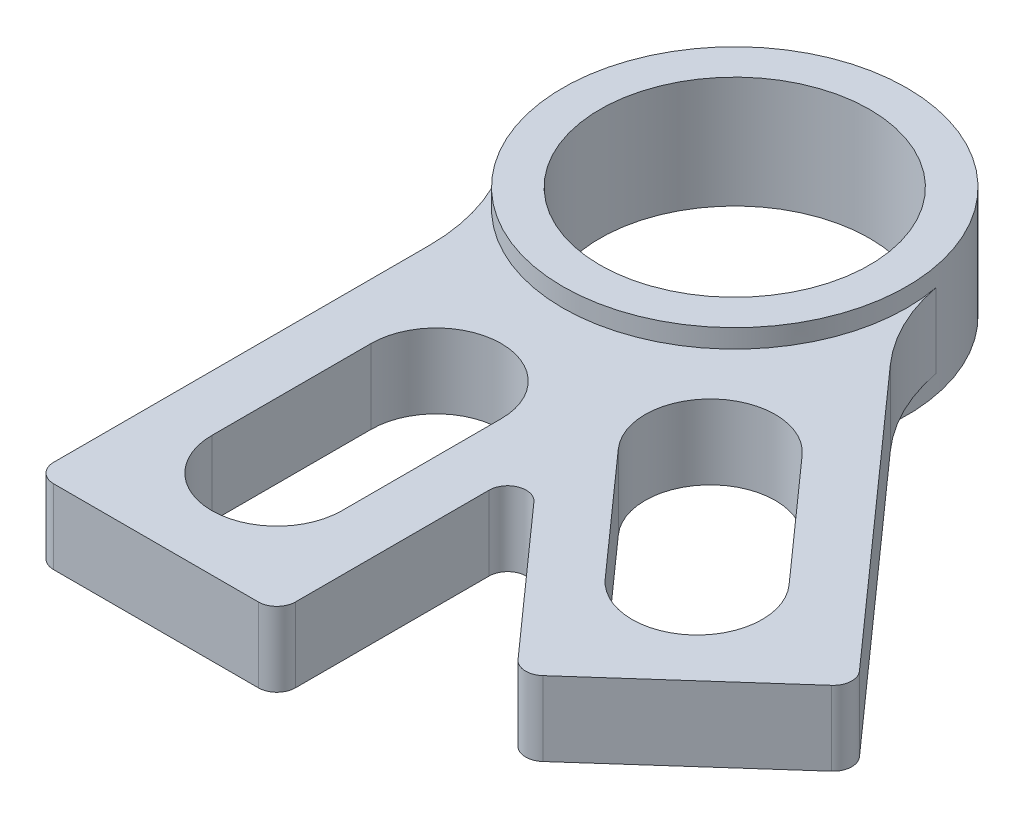
ISO-10303-21;
HEADER;
FILE_DESCRIPTION(('STEP AP214'),'2;1');
FILE_NAME('part.step','',(''),(''),'','','');
FILE_SCHEMA(('AUTOMOTIVE_DESIGN { 1 0 10303 214 1 1 1 1 }'));
ENDSEC;
DATA;
#1=APPLICATION_CONTEXT('core data for automotive mechanical design processes');
#2=APPLICATION_PROTOCOL_DEFINITION('international standard','automotive_design',2000,#1);
#3=PRODUCT_CONTEXT('',#1,'mechanical');
#4=PRODUCT('Part','Part','',(#3));
#5=PRODUCT_RELATED_PRODUCT_CATEGORY('part','',(#4));
#6=PRODUCT_DEFINITION_FORMATION('','',#4);
#7=PRODUCT_DEFINITION_CONTEXT('part definition',#1,'design');
#8=PRODUCT_DEFINITION('design','',#6,#7);
#9=PRODUCT_DEFINITION_SHAPE('','',#8);
#10=(LENGTH_UNIT() NAMED_UNIT(*) SI_UNIT(.MILLI.,.METRE.));
#11=(NAMED_UNIT(*) PLANE_ANGLE_UNIT() SI_UNIT($,.RADIAN.));
#12=(NAMED_UNIT(*) SI_UNIT($,.STERADIAN.) SOLID_ANGLE_UNIT());
#13=UNCERTAINTY_MEASURE_WITH_UNIT(LENGTH_MEASURE(1.E-05),#10,'distance_accuracy_value','');
#14=(GEOMETRIC_REPRESENTATION_CONTEXT(3) GLOBAL_UNCERTAINTY_ASSIGNED_CONTEXT((#13)) GLOBAL_UNIT_ASSIGNED_CONTEXT((#10,
#11,#12)) REPRESENTATION_CONTEXT('',''));
#15=CARTESIAN_POINT('',(0.,0.,0.));
#16=DIRECTION('',(0.,0.,1.));
#17=DIRECTION('',(1.,0.,0.));
#18=AXIS2_PLACEMENT_3D('',#15,#16,#17);
#19=CARTESIAN_POINT('',(0.,4.7625,0.));
#20=DIRECTION('',(0.,-1.,0.));
#21=DIRECTION('',(0.,0.,-1.));
#22=AXIS2_PLACEMENT_3D('',#19,#20,#21);
#23=CYLINDRICAL_SURFACE('',#22,11.5062);
#24=CARTESIAN_POINT('',(0.,4.7625,0.));
#25=DIRECTION('',(0.,1.,0.));
#26=DIRECTION('',(0.,0.,1.));
#27=AXIS2_PLACEMENT_3D('',#24,#25,#26);
#28=CIRCLE('',#27,11.5062);
#29=CARTESIAN_POINT('',(0.,4.7625,-11.5062));
#30=VERTEX_POINT('',#29);
#31=EDGE_CURVE('E301',#30,#30,#28,.T.);
#32=CARTESIAN_POINT('',(0.,-4.7625,0.));
#33=DIRECTION('',(0.,1.,0.));
#34=DIRECTION('',(0.,0.,1.));
#35=AXIS2_PLACEMENT_3D('',#32,#33,#34);
#36=CIRCLE('',#35,11.5062);
#37=CARTESIAN_POINT('',(0.,-4.7625,-11.5062));
#38=VERTEX_POINT('',#37);
#39=EDGE_CURVE('E296',#38,#38,#36,.T.);
#40=CARTESIAN_POINT('',(0.,4.7625,-11.5062));
#41=CARTESIAN_POINT('',(0.,4.66328125,-11.5062));
#42=CARTESIAN_POINT('',(0.,4.5640625,-11.5062));
#43=CARTESIAN_POINT('',(0.,4.365625,-11.5062));
#44=CARTESIAN_POINT('',(0.,4.26640625,-11.5062));
#45=CARTESIAN_POINT('',(0.,4.06796875,-11.5062));
#46=CARTESIAN_POINT('',(0.,3.96875,-11.5062));
#47=CARTESIAN_POINT('',(0.,3.7703125,-11.5062));
#48=CARTESIAN_POINT('',(0.,3.67109375,-11.5062));
#49=CARTESIAN_POINT('',(0.,3.47265625,-11.5062));
#50=CARTESIAN_POINT('',(0.,3.3734375,-11.5062));
#51=CARTESIAN_POINT('',(0.,3.175,-11.5062));
#52=CARTESIAN_POINT('',(0.,3.07578125,-11.5062));
#53=CARTESIAN_POINT('',(0.,2.87734375,-11.5062));
#54=CARTESIAN_POINT('',(0.,2.778125,-11.5062));
#55=CARTESIAN_POINT('',(0.,2.5796875,-11.5062));
#56=CARTESIAN_POINT('',(0.,2.48046875,-11.5062));
#57=CARTESIAN_POINT('',(0.,2.28203125,-11.5062));
#58=CARTESIAN_POINT('',(0.,2.1828125,-11.5062));
#59=CARTESIAN_POINT('',(0.,1.984375,-11.5062));
#60=CARTESIAN_POINT('',(0.,1.88515625,-11.5062));
#61=CARTESIAN_POINT('',(0.,1.68671875,-11.5062));
#62=CARTESIAN_POINT('',(0.,1.5875,-11.5062));
#63=CARTESIAN_POINT('',(0.,1.3890625,-11.5062));
#64=CARTESIAN_POINT('',(0.,1.28984375,-11.5062));
#65=CARTESIAN_POINT('',(0.,1.09140625,-11.5062));
#66=CARTESIAN_POINT('',(0.,0.992187499999999,-11.5062));
#67=CARTESIAN_POINT('',(0.,0.79375,-11.5062));
#68=CARTESIAN_POINT('',(0.,0.69453125,-11.5062));
#69=CARTESIAN_POINT('',(0.,0.49609375,-11.5062));
#70=CARTESIAN_POINT('',(0.,0.396875,-11.5062));
#71=CARTESIAN_POINT('',(0.,0.1984375,-11.5062));
#72=CARTESIAN_POINT('',(0.,0.0992187500000001,-11.5062));
#73=CARTESIAN_POINT('',(0.,-0.0992187500000001,-11.5062));
#74=CARTESIAN_POINT('',(0.,-0.1984375,-11.5062));
#75=CARTESIAN_POINT('',(0.,-0.396875,-11.5062));
#76=CARTESIAN_POINT('',(0.,-0.49609375,-11.5062));
#77=CARTESIAN_POINT('',(0.,-0.69453125,-11.5062));
#78=CARTESIAN_POINT('',(0.,-0.793750000000001,-11.5062));
#79=CARTESIAN_POINT('',(0.,-0.992187500000001,-11.5062));
#80=CARTESIAN_POINT('',(0.,-1.09140625,-11.5062));
#81=CARTESIAN_POINT('',(0.,-1.28984375,-11.5062));
#82=CARTESIAN_POINT('',(0.,-1.3890625,-11.5062));
#83=CARTESIAN_POINT('',(0.,-1.5875,-11.5062));
#84=CARTESIAN_POINT('',(0.,-1.68671875,-11.5062));
#85=CARTESIAN_POINT('',(0.,-1.88515625,-11.5062));
#86=CARTESIAN_POINT('',(0.,-1.984375,-11.5062));
#87=CARTESIAN_POINT('',(0.,-2.1828125,-11.5062));
#88=CARTESIAN_POINT('',(0.,-2.28203125,-11.5062));
#89=CARTESIAN_POINT('',(0.,-2.48046875,-11.5062));
#90=CARTESIAN_POINT('',(0.,-2.5796875,-11.5062));
#91=CARTESIAN_POINT('',(0.,-2.778125,-11.5062));
#92=CARTESIAN_POINT('',(0.,-2.87734375,-11.5062));
#93=CARTESIAN_POINT('',(0.,-3.07578125,-11.5062));
#94=CARTESIAN_POINT('',(0.,-3.175,-11.5062));
#95=CARTESIAN_POINT('',(0.,-3.3734375,-11.5062));
#96=CARTESIAN_POINT('',(0.,-3.47265625,-11.5062));
#97=CARTESIAN_POINT('',(0.,-3.67109375,-11.5062));
#98=CARTESIAN_POINT('',(0.,-3.7703125,-11.5062));
#99=CARTESIAN_POINT('',(0.,-3.96875,-11.5062));
#100=CARTESIAN_POINT('',(0.,-4.06796875,-11.5062));
#101=CARTESIAN_POINT('',(0.,-4.26640625,-11.5062));
#102=CARTESIAN_POINT('',(0.,-4.365625,-11.5062));
#103=CARTESIAN_POINT('',(0.,-4.5640625,-11.5062));
#104=CARTESIAN_POINT('',(0.,-4.66328125,-11.5062));
#105=CARTESIAN_POINT('',(0.,-4.7625,-11.5062));
#106=B_SPLINE_CURVE_WITH_KNOTS('',3,(#40,#41,#42,#43,#44,#45,#46,#47,#48,#49,#50,#51,#52,#53,
#54,#55,#56,#57,#58,#59,#60,#61,#62,#63,#64,#65,#66,#67,#68,#69,#70,#71,#72,#73,#74,#75,#76,#77,
#78,#79,#80,#81,#82,#83,#84,#85,#86,#87,#88,#89,#90,#91,#92,#93,#94,#95,#96,#97,#98,#99,#100,
#101,#102,#103,#104,#105),.UNSPECIFIED.,.F.,.F.,(4,2,2,2,2,2,2,2,2,2,2,2,2,2,2,2,2,2,2,2,2,2,2,
2,2,2,2,2,2,2,2,2,4),(0.,0.29765625,0.5953125,0.892968750000001,1.190625,1.48828125,1.7859375,
2.08359375,2.38125,2.67890625,2.9765625,3.27421875,3.571875,3.86953125,4.1671875,4.46484375,
4.7625,5.06015625,5.3578125,5.65546875,5.953125,6.25078125,6.5484375,6.84609375,7.14375,
7.44140625,7.7390625,8.03671875,8.334375,8.63203125,8.9296875,9.22734375,9.525),.UNSPECIFIED.);
#107=EDGE_CURVE('BSEAM43',#30,#38,#106,.T.);
#108=ORIENTED_EDGE('',*,*,#31,.T.);
#109=ORIENTED_EDGE('',*,*,#39,.F.);
#110=ORIENTED_EDGE('',*,*,#107,.T.);
#111=ORIENTED_EDGE('',*,*,#107,.F.);
#112=EDGE_LOOP('',(#108,#110,#109,#111));
#113=FACE_BOUND('',#112,.T.);
#114=ADVANCED_FACE('F43',(#113),#23,.F.);
#115=CARTESIAN_POINT('',(0.,4.7625,0.));
#116=DIRECTION('',(0.,-1.,0.));
#117=DIRECTION('',(0.,0.,-1.));
#118=AXIS2_PLACEMENT_3D('',#115,#116,#117);
#119=CYLINDRICAL_SURFACE('',#118,14.6812);
#120=DIRECTION('',(0.,-1.,0.));
#121=VECTOR('',#120,1.);
#122=CARTESIAN_POINT('',(14.423910328864,4.7625,-2.7365021953018));
#123=LINE('',#122,#121);
#124=CARTESIAN_POINT('',(14.423910328864,3.175,-2.7365021953018));
#125=VERTEX_POINT('',#124);
#126=CARTESIAN_POINT('',(14.423910328864,-3.175,-2.7365021953018));
#127=VERTEX_POINT('',#126);
#128=EDGE_CURVE('E315',#125,#127,#123,.T.);
#129=ORIENTED_EDGE('',*,*,#128,.T.);
#130=CARTESIAN_POINT('',(0.,-3.175,0.));
#131=DIRECTION('',(0.,1.,0.));
#132=DIRECTION('',(0.,0.,1.));
#133=AXIS2_PLACEMENT_3D('',#130,#131,#132);
#134=CIRCLE('',#133,14.6812);
#135=CARTESIAN_POINT('',(-12.5938687913907,-3.175,7.54533646070437));
#136=VERTEX_POINT('',#135);
#137=EDGE_CURVE('E272',#136,#127,#134,.T.);
#138=ORIENTED_EDGE('',*,*,#137,.F.);
#139=DIRECTION('',(0.,-1.,0.));
#140=VECTOR('',#139,1.);
#141=CARTESIAN_POINT('',(-12.5938687913907,4.7625,7.54533646070436));
#142=LINE('',#141,#140);
#143=CARTESIAN_POINT('',(-12.5938687913907,3.175,7.54533646070437));
#144=VERTEX_POINT('',#143);
#145=EDGE_CURVE('E308',#136,#144,#142,.F.);
#146=ORIENTED_EDGE('',*,*,#145,.T.);
#147=CARTESIAN_POINT('',(0.,3.175,0.));
#148=DIRECTION('',(0.,1.,0.));
#149=DIRECTION('',(0.,0.,1.));
#150=AXIS2_PLACEMENT_3D('',#147,#148,#149);
#151=CIRCLE('',#150,14.6812);
#152=EDGE_CURVE('E234',#144,#125,#151,.T.);
#153=ORIENTED_EDGE('',*,*,#152,.T.);
#154=EDGE_LOOP('',(#129,#138,#146,#153));
#155=FACE_BOUND('',#154,.T.);
#156=CARTESIAN_POINT('',(0.,4.7625,0.));
#157=DIRECTION('',(0.,1.,0.));
#158=DIRECTION('',(0.,0.,1.));
#159=AXIS2_PLACEMENT_3D('',#156,#157,#158);
#160=CIRCLE('',#159,14.6812);
#161=CARTESIAN_POINT('',(0.,4.7625,14.6812));
#162=VERTEX_POINT('',#161);
#163=EDGE_CURVE('E304',#162,#162,#160,.T.);
#164=ORIENTED_EDGE('',*,*,#163,.F.);
#165=EDGE_LOOP('',(#164));
#166=FACE_BOUND('',#165,.T.);
#167=CARTESIAN_POINT('',(0.,-4.7625,0.));
#168=DIRECTION('',(0.,1.,0.));
#169=DIRECTION('',(0.,0.,1.));
#170=AXIS2_PLACEMENT_3D('',#167,#168,#169);
#171=CIRCLE('',#170,14.6812);
#172=CARTESIAN_POINT('',(0.,-4.7625,14.6812));
#173=VERTEX_POINT('',#172);
#174=EDGE_CURVE('E305',#173,#173,#171,.T.);
#175=ORIENTED_EDGE('',*,*,#174,.T.);
#176=EDGE_LOOP('',(#175));
#177=FACE_BOUND('',#176,.T.);
#178=ADVANCED_FACE('F411',(#155,#166,#177),#119,.T.);
#179=CARTESIAN_POINT('',(0.,4.7625,0.));
#180=DIRECTION('',(0.,1.,0.));
#181=DIRECTION('',(0.,0.,1.));
#182=AXIS2_PLACEMENT_3D('',#179,#180,#181);
#183=PLANE('',#182);
#184=ORIENTED_EDGE('',*,*,#31,.F.);
#185=EDGE_LOOP('',(#184));
#186=FACE_BOUND('',#185,.T.);
#187=ORIENTED_EDGE('',*,*,#163,.T.);
#188=EDGE_LOOP('',(#187));
#189=FACE_BOUND('',#188,.T.);
#190=ADVANCED_FACE('F447',(#186,#189),#183,.T.);
#191=CARTESIAN_POINT('',(0.,-4.7625,0.));
#192=DIRECTION('',(0.,1.,0.));
#193=DIRECTION('',(0.,0.,1.));
#194=AXIS2_PLACEMENT_3D('',#191,#192,#193);
#195=PLANE('',#194);
#196=ORIENTED_EDGE('',*,*,#39,.T.);
#197=EDGE_LOOP('',(#196));
#198=FACE_BOUND('',#197,.T.);
#199=ORIENTED_EDGE('',*,*,#174,.F.);
#200=EDGE_LOOP('',(#199));
#201=FACE_BOUND('',#200,.T.);
#202=ADVANCED_FACE('F621',(#198,#201),#195,.F.);
#203=CARTESIAN_POINT('',(-10.31875,3.175,0.));
#204=DIRECTION('',(-1.,0.,0.));
#205=DIRECTION('',(0.,0.,1.));
#206=AXIS2_PLACEMENT_3D('',#203,#204,#205);
#207=PLANE('',#206);
#208=DIRECTION('',(0.,0.,-1.));
#209=VECTOR('',#208,1.);
#210=CARTESIAN_POINT('',(-10.31875,-3.175,0.));
#211=LINE('',#210,#209);
#212=CARTESIAN_POINT('',(-10.31875,-3.175,47.8028));
#213=VERTEX_POINT('',#212);
#214=CARTESIAN_POINT('',(-10.31875,-3.175,15.7694921185655));
#215=VERTEX_POINT('',#214);
#216=EDGE_CURVE('E274',#213,#215,#211,.T.);
#217=ORIENTED_EDGE('',*,*,#216,.F.);
#218=DIRECTION('',(0.,-1.,0.));
#219=VECTOR('',#218,1.);
#220=CARTESIAN_POINT('',(-10.31875,3.175,47.8028));
#221=LINE('',#220,#219);
#222=CARTESIAN_POINT('',(-10.31875,3.175,47.8028));
#223=VERTEX_POINT('',#222);
#224=EDGE_CURVE('E374',#213,#223,#221,.F.);
#225=ORIENTED_EDGE('',*,*,#224,.T.);
#226=DIRECTION('',(0.,0.,-1.));
#227=VECTOR('',#226,1.);
#228=CARTESIAN_POINT('',(-10.31875,3.175,0.));
#229=LINE('',#228,#227);
#230=CARTESIAN_POINT('',(-10.31875,3.175,15.7694921185655));
#231=VERTEX_POINT('',#230);
#232=EDGE_CURVE('E236',#223,#231,#229,.T.);
#233=ORIENTED_EDGE('',*,*,#232,.T.);
#234=DIRECTION('',(0.,-1.,0.));
#235=VECTOR('',#234,1.);
#236=CARTESIAN_POINT('',(-10.31875,3.175,15.7694921185655));
#237=LINE('',#236,#235);
#238=EDGE_CURVE('E321',#231,#215,#237,.T.);
#239=ORIENTED_EDGE('',*,*,#238,.T.);
#240=EDGE_LOOP('',(#217,#225,#233,#239));
#241=FACE_BOUND('',#240,.T.);
#242=ADVANCED_FACE('F613',(#241),#207,.T.);
#243=CARTESIAN_POINT('',(0.,3.175,49.3903));
#244=DIRECTION('',(0.,0.,-1.));
#245=DIRECTION('',(-1.,0.,0.));
#246=AXIS2_PLACEMENT_3D('',#243,#244,#245);
#247=PLANE('',#246);
#248=DIRECTION('',(1.,0.,0.));
#249=VECTOR('',#248,1.);
#250=CARTESIAN_POINT('',(0.,-3.175,49.3903));
#251=LINE('',#250,#249);
#252=CARTESIAN_POINT('',(-8.73124999999999,-3.175,49.3903));
#253=VERTEX_POINT('',#252);
#254=CARTESIAN_POINT('',(8.73125,-3.175,49.3903));
#255=VERTEX_POINT('',#254);
#256=EDGE_CURVE('E276',#253,#255,#251,.T.);
#257=ORIENTED_EDGE('',*,*,#256,.T.);
#258=DIRECTION('',(0.,-1.,0.));
#259=VECTOR('',#258,1.);
#260=CARTESIAN_POINT('',(8.73125,3.175,49.3903));
#261=LINE('',#260,#259);
#262=CARTESIAN_POINT('',(8.73125,3.175,49.3903));
#263=VERTEX_POINT('',#262);
#264=EDGE_CURVE('E372',#255,#263,#261,.F.);
#265=ORIENTED_EDGE('',*,*,#264,.T.);
#266=DIRECTION('',(1.,0.,0.));
#267=VECTOR('',#266,1.);
#268=CARTESIAN_POINT('',(0.,3.175,49.3903));
#269=LINE('',#268,#267);
#270=CARTESIAN_POINT('',(-8.73124999999999,3.175,49.3903));
#271=VERTEX_POINT('',#270);
#272=EDGE_CURVE('E238',#271,#263,#269,.T.);
#273=ORIENTED_EDGE('',*,*,#272,.F.);
#274=DIRECTION('',(0.,-1.,0.));
#275=VECTOR('',#274,1.);
#276=CARTESIAN_POINT('',(-8.73124999999999,-3.175,49.3903));
#277=LINE('',#276,#275);
#278=EDGE_CURVE('E369',#271,#253,#277,.T.);
#279=ORIENTED_EDGE('',*,*,#278,.T.);
#280=EDGE_LOOP('',(#257,#265,#273,#279));
#281=FACE_BOUND('',#280,.T.);
#282=ADVANCED_FACE('F428',(#281),#247,.F.);
#283=CARTESIAN_POINT('',(10.31875,3.175,0.));
#284=DIRECTION('',(-1.,0.,0.));
#285=DIRECTION('',(0.,0.,1.));
#286=AXIS2_PLACEMENT_3D('',#283,#284,#285);
#287=PLANE('',#286);
#288=DIRECTION('',(0.,0.,-1.));
#289=VECTOR('',#288,1.);
#290=CARTESIAN_POINT('',(10.31875,-3.175,0.));
#291=LINE('',#290,#289);
#292=CARTESIAN_POINT('',(10.31875,-3.175,47.8028));
#293=VERTEX_POINT('',#292);
#294=CARTESIAN_POINT('',(10.31875,-3.175,31.2862750926945));
#295=VERTEX_POINT('',#294);
#296=EDGE_CURVE('E279',#293,#295,#291,.T.);
#297=ORIENTED_EDGE('',*,*,#296,.T.);
#298=DIRECTION('',(0.,-1.,0.));
#299=VECTOR('',#298,1.);
#300=CARTESIAN_POINT('',(10.31875,3.175,31.2862750926945));
#301=LINE('',#300,#299);
#302=CARTESIAN_POINT('',(10.31875,3.175,31.2862750926945));
#303=VERTEX_POINT('',#302);
#304=EDGE_CURVE('E367',#295,#303,#301,.F.);
#305=ORIENTED_EDGE('',*,*,#304,.T.);
#306=DIRECTION('',(0.,0.,-1.));
#307=VECTOR('',#306,1.);
#308=CARTESIAN_POINT('',(10.31875,3.175,0.));
#309=LINE('',#308,#307);
#310=CARTESIAN_POINT('',(10.31875,3.175,47.8028));
#311=VERTEX_POINT('',#310);
#312=EDGE_CURVE('E241',#311,#303,#309,.T.);
#313=ORIENTED_EDGE('',*,*,#312,.F.);
#314=DIRECTION('',(0.,-1.,0.));
#315=VECTOR('',#314,1.);
#316=CARTESIAN_POINT('',(10.31875,3.175,47.8028));
#317=LINE('',#316,#315);
#318=EDGE_CURVE('E364',#311,#293,#317,.T.);
#319=ORIENTED_EDGE('',*,*,#318,.T.);
#320=EDGE_LOOP('',(#297,#305,#313,#319));
#321=FACE_BOUND('',#320,.T.);
#322=ADVANCED_FACE('F383',(#321),#287,.F.);
#323=CARTESIAN_POINT('',(-7.70802927607697,3.175,6.86023951780406));
#324=DIRECTION('',(-0.746992540382989,0.,0.664832418442549));
#325=DIRECTION('',(0.664832418442549,0.,0.746992540382989));
#326=AXIS2_PLACEMENT_3D('',#323,#324,#325);
#327=PLANE('',#326);
#328=DIRECTION('',(-0.664832418442549,0.,-0.746992540382989));
#329=VECTOR('',#328,1.);
#330=CARTESIAN_POINT('',(-7.70802927607697,-3.175,6.86023951780406));
#331=LINE('',#330,#329);
#332=CARTESIAN_POINT('',(24.0728218562485,-3.175,42.568574527224));
#333=VERTEX_POINT('',#332);
#334=CARTESIAN_POINT('',(13.092100657858,-3.175,30.2308536284169));
#335=VERTEX_POINT('',#334);
#336=EDGE_CURVE('E282',#333,#335,#331,.T.);
#337=ORIENTED_EDGE('',*,*,#336,.F.);
#338=DIRECTION('',(0.,-1.,0.));
#339=VECTOR('',#338,1.);
#340=CARTESIAN_POINT('',(24.0728218562485,3.175,42.568574527224));
#341=LINE('',#340,#339);
#342=CARTESIAN_POINT('',(24.0728218562485,3.175,42.568574527224));
#343=VERTEX_POINT('',#342);
#344=EDGE_CURVE('E63',#333,#343,#341,.F.);
#345=ORIENTED_EDGE('',*,*,#344,.T.);
#346=DIRECTION('',(-0.664832418442549,0.,-0.746992540382989));
#347=VECTOR('',#346,1.);
#348=CARTESIAN_POINT('',(-7.70802927607697,3.175,6.86023951780406));
#349=LINE('',#348,#347);
#350=CARTESIAN_POINT('',(13.092100657858,3.175,30.2308536284169));
#351=VERTEX_POINT('',#350);
#352=EDGE_CURVE('E243',#343,#351,#349,.T.);
#353=ORIENTED_EDGE('',*,*,#352,.T.);
#354=DIRECTION('',(0.,-1.,0.));
#355=VECTOR('',#354,1.);
#356=CARTESIAN_POINT('',(13.092100657858,3.175,30.2308536284169));
#357=LINE('',#356,#355);
#358=EDGE_CURVE('E360',#351,#335,#357,.T.);
#359=ORIENTED_EDGE('',*,*,#358,.T.);
#360=EDGE_LOOP('',(#337,#345,#353,#359));
#361=FACE_BOUND('',#360,.T.);
#362=ADVANCED_FACE('F387',(#361),#327,.T.);
#363=CARTESIAN_POINT('',(32.836272596603,3.175,36.894185667278));
#364=DIRECTION('',(-0.664832418442549,0.,-0.746992540382989));
#365=DIRECTION('',(-0.746992540382989,0.,0.664832418442549));
#366=AXIS2_PLACEMENT_3D('',#363,#364,#365);
#367=PLANE('',#366);
#368=DIRECTION('',(0.746992540382989,0.,-0.664832418442549));
#369=VECTOR('',#368,1.);
#370=CARTESIAN_POINT('',(32.836272596603,-3.175,36.894185667278));
#371=LINE('',#370,#369);
#372=CARTESIAN_POINT('',(26.3140939783841,-3.175,42.6990037208044));
#373=VERTEX_POINT('',#372);
#374=CARTESIAN_POINT('',(39.358451214822,-3.175,31.0893676137514));
#375=VERTEX_POINT('',#374);
#376=EDGE_CURVE('E285',#373,#375,#371,.T.);
#377=ORIENTED_EDGE('',*,*,#376,.T.);
#378=DIRECTION('',(0.,-1.,0.));
#379=VECTOR('',#378,1.);
#380=CARTESIAN_POINT('',(39.358451214822,3.175,31.0893676137514));
#381=LINE('',#380,#379);
#382=CARTESIAN_POINT('',(39.358451214822,3.175,31.0893676137514));
#383=VERTEX_POINT('',#382);
#384=EDGE_CURVE('E350',#375,#383,#381,.F.);
#385=ORIENTED_EDGE('',*,*,#384,.T.);
#386=DIRECTION('',(0.746992540382989,0.,-0.664832418442549));
#387=VECTOR('',#386,1.);
#388=CARTESIAN_POINT('',(32.836272596603,3.175,36.894185667278));
#389=LINE('',#388,#387);
#390=CARTESIAN_POINT('',(26.3140939783841,3.175,42.6990037208044));
#391=VERTEX_POINT('',#390);
#392=EDGE_CURVE('E245',#391,#383,#389,.T.);
#393=ORIENTED_EDGE('',*,*,#392,.F.);
#394=DIRECTION('',(0.,-1.,0.));
#395=VECTOR('',#394,1.);
#396=CARTESIAN_POINT('',(26.3140939783841,-3.175,42.6990037208044));
#397=LINE('',#396,#395);
#398=EDGE_CURVE('E347',#391,#373,#397,.T.);
#399=ORIENTED_EDGE('',*,*,#398,.T.);
#400=EDGE_LOOP('',(#377,#385,#393,#399));
#401=FACE_BOUND('',#400,.T.);
#402=ADVANCED_FACE('F395',(#401),#367,.F.);
#403=CARTESIAN_POINT('',(0.,3.175,25.48255));
#404=DIRECTION('',(0.,-1.,0.));
#405=DIRECTION('',(0.,0.,-1.));
#406=AXIS2_PLACEMENT_3D('',#403,#404,#405);
#407=CYLINDRICAL_SURFACE('',#406,5.55625);
#408=CARTESIAN_POINT('',(0.,-3.175,25.48255));
#409=DIRECTION('',(0.,1.,0.));
#410=DIRECTION('',(0.,0.,1.));
#411=AXIS2_PLACEMENT_3D('',#408,#409,#410);
#412=CIRCLE('',#411,5.55625);
#413=CARTESIAN_POINT('',(5.55625,-3.175,25.48255));
#414=VERTEX_POINT('',#413);
#415=CARTESIAN_POINT('',(-5.55624999999999,-3.175,25.48255));
#416=VERTEX_POINT('',#415);
#417=EDGE_CURVE('E260',#414,#416,#412,.T.);
#418=ORIENTED_EDGE('',*,*,#417,.F.);
#419=DIRECTION('',(0.,-1.,0.));
#420=VECTOR('',#419,1.);
#421=CARTESIAN_POINT('',(5.55625,3.175,25.48255));
#422=LINE('',#421,#420);
#423=CARTESIAN_POINT('',(5.55625,3.175,25.48255));
#424=VERTEX_POINT('',#423);
#425=EDGE_CURVE('E294',#424,#414,#422,.T.);
#426=ORIENTED_EDGE('',*,*,#425,.F.);
#427=CARTESIAN_POINT('',(0.,3.175,25.48255));
#428=DIRECTION('',(0.,1.,0.));
#429=DIRECTION('',(0.,0.,1.));
#430=AXIS2_PLACEMENT_3D('',#427,#428,#429);
#431=CIRCLE('',#430,5.55625);
#432=CARTESIAN_POINT('',(-5.55624999999999,3.175,25.48255));
#433=VERTEX_POINT('',#432);
#434=EDGE_CURVE('E223',#424,#433,#431,.T.);
#435=ORIENTED_EDGE('',*,*,#434,.T.);
#436=DIRECTION('',(0.,-1.,0.));
#437=VECTOR('',#436,1.);
#438=CARTESIAN_POINT('',(-5.55624999999999,3.175,25.48255));
#439=LINE('',#438,#437);
#440=EDGE_CURVE('E202',#433,#416,#439,.T.);
#441=ORIENTED_EDGE('',*,*,#440,.T.);
#442=EDGE_LOOP('',(#418,#426,#435,#441));
#443=FACE_BOUND('',#442,.T.);
#444=ADVANCED_FACE('F575',(#443),#407,.F.);
#445=CARTESIAN_POINT('',(5.55625,3.175,0.));
#446=DIRECTION('',(-1.,0.,0.));
#447=DIRECTION('',(0.,0.,1.));
#448=AXIS2_PLACEMENT_3D('',#445,#446,#447);
#449=PLANE('',#448);
#450=DIRECTION('',(0.,0.,-1.));
#451=VECTOR('',#450,1.);
#452=CARTESIAN_POINT('',(5.55625,-3.175,0.));
#453=LINE('',#452,#451);
#454=CARTESIAN_POINT('',(5.55625,-3.175,39.07155));
#455=VERTEX_POINT('',#454);
#456=EDGE_CURVE('E263',#455,#414,#453,.T.);
#457=ORIENTED_EDGE('',*,*,#456,.F.);
#458=DIRECTION('',(0.,-1.,0.));
#459=VECTOR('',#458,1.);
#460=CARTESIAN_POINT('',(5.55625,3.175,39.07155));
#461=LINE('',#460,#459);
#462=CARTESIAN_POINT('',(5.55625,3.175,39.07155));
#463=VERTEX_POINT('',#462);
#464=EDGE_CURVE('E292',#463,#455,#461,.T.);
#465=ORIENTED_EDGE('',*,*,#464,.F.);
#466=DIRECTION('',(0.,0.,-1.));
#467=VECTOR('',#466,1.);
#468=CARTESIAN_POINT('',(5.55625,3.175,0.));
#469=LINE('',#468,#467);
#470=EDGE_CURVE('E226',#463,#424,#469,.T.);
#471=ORIENTED_EDGE('',*,*,#470,.T.);
#472=ORIENTED_EDGE('',*,*,#425,.T.);
#473=EDGE_LOOP('',(#457,#465,#471,#472));
#474=FACE_BOUND('',#473,.T.);
#475=ADVANCED_FACE('F566',(#474),#449,.T.);
#476=CARTESIAN_POINT('',(0.,3.175,39.07155));
#477=DIRECTION('',(0.,-1.,0.));
#478=DIRECTION('',(0.,0.,-1.));
#479=AXIS2_PLACEMENT_3D('',#476,#477,#478);
#480=CYLINDRICAL_SURFACE('',#479,5.55625);
#481=CARTESIAN_POINT('',(0.,-3.175,39.07155));
#482=DIRECTION('',(0.,1.,0.));
#483=DIRECTION('',(0.,0.,1.));
#484=AXIS2_PLACEMENT_3D('',#481,#482,#483);
#485=CIRCLE('',#484,5.55625);
#486=CARTESIAN_POINT('',(-5.55625,-3.175,39.07155));
#487=VERTEX_POINT('',#486);
#488=EDGE_CURVE('E266',#487,#455,#485,.T.);
#489=ORIENTED_EDGE('',*,*,#488,.F.);
#490=DIRECTION('',(0.,-1.,0.));
#491=VECTOR('',#490,1.);
#492=CARTESIAN_POINT('',(-5.55625,3.175,39.07155));
#493=LINE('',#492,#491);
#494=CARTESIAN_POINT('',(-5.55625,3.175,39.07155));
#495=VERTEX_POINT('',#494);
#496=EDGE_CURVE('E290',#495,#487,#493,.T.);
#497=ORIENTED_EDGE('',*,*,#496,.F.);
#498=CARTESIAN_POINT('',(0.,3.175,39.07155));
#499=DIRECTION('',(0.,1.,0.));
#500=DIRECTION('',(0.,0.,1.));
#501=AXIS2_PLACEMENT_3D('',#498,#499,#500);
#502=CIRCLE('',#501,5.55625);
#503=EDGE_CURVE('E229',#495,#463,#502,.T.);
#504=ORIENTED_EDGE('',*,*,#503,.T.);
#505=ORIENTED_EDGE('',*,*,#464,.T.);
#506=EDGE_LOOP('',(#489,#497,#504,#505));
#507=FACE_BOUND('',#506,.T.);
#508=ADVANCED_FACE('F558',(#507),#480,.F.);
#509=CARTESIAN_POINT('',(16.9416253445825,3.175,19.0352747599371));
#510=DIRECTION('',(0.,-1.,0.));
#511=DIRECTION('',(0.,0.,-1.));
#512=AXIS2_PLACEMENT_3D('',#509,#510,#511);
#513=CYLINDRICAL_SURFACE('',#512,5.55625000000044);
#514=CARTESIAN_POINT('',(16.9416253445825,-3.175,19.0352747599371));
#515=DIRECTION('',(0.,1.,0.));
#516=DIRECTION('',(0.,0.,1.));
#517=AXIS2_PLACEMENT_3D('',#514,#515,#516);
#518=CIRCLE('',#517,5.55625000000044);
#519=CARTESIAN_POINT('',(21.0921026470862,-3.175,15.3412996349651));
#520=VERTEX_POINT('',#519);
#521=CARTESIAN_POINT('',(12.7911480420796,-3.175,22.7292498849085));
#522=VERTEX_POINT('',#521);
#523=EDGE_CURVE('E197',#520,#522,#518,.T.);
#524=ORIENTED_EDGE('',*,*,#523,.F.);
#525=DIRECTION('',(0.,-1.,0.));
#526=VECTOR('',#525,1.);
#527=CARTESIAN_POINT('',(21.0921026470862,3.175,15.3412996349651));
#528=LINE('',#527,#526);
#529=CARTESIAN_POINT('',(21.0921026470862,3.175,15.3412996349651));
#530=VERTEX_POINT('',#529);
#531=EDGE_CURVE('E192',#530,#520,#528,.T.);
#532=ORIENTED_EDGE('',*,*,#531,.F.);
#533=CARTESIAN_POINT('',(16.9416253445825,3.175,19.0352747599371));
#534=DIRECTION('',(0.,1.,0.));
#535=DIRECTION('',(0.,0.,1.));
#536=AXIS2_PLACEMENT_3D('',#533,#534,#535);
#537=CIRCLE('',#536,5.55625000000044);
#538=CARTESIAN_POINT('',(12.7911480420796,3.175,22.7292498849085));
#539=VERTEX_POINT('',#538);
#540=EDGE_CURVE('E195',#530,#539,#537,.T.);
#541=ORIENTED_EDGE('',*,*,#540,.T.);
#542=DIRECTION('',(0.,-1.,0.));
#543=VECTOR('',#542,1.);
#544=CARTESIAN_POINT('',(12.7911480420796,3.175,22.7292498849085));
#545=LINE('',#544,#543);
#546=EDGE_CURVE('E250',#539,#522,#545,.T.);
#547=ORIENTED_EDGE('',*,*,#546,.T.);
#548=EDGE_LOOP('',(#524,#532,#541,#547));
#549=FACE_BOUND('',#548,.T.);
#550=ADVANCED_FACE('F194',(#549),#513,.F.);
#551=CARTESIAN_POINT('',(4.15047730250302,3.175,-3.69397512497144));
#552=DIRECTION('',(-0.746992540382989,0.,0.664832418442548));
#553=DIRECTION('',(0.664832418442549,0.,0.746992540382989));
#554=AXIS2_PLACEMENT_3D('',#551,#552,#553);
#555=PLANE('',#554);
#556=DIRECTION('',(-0.664832418442549,0.,-0.746992540382989));
#557=VECTOR('',#556,1.);
#558=CARTESIAN_POINT('',(4.15047730250302,-3.175,-3.69397512497144));
#559=LINE('',#558,#557);
#560=CARTESIAN_POINT('',(30.126510381302,-3.175,25.4921812662296));
#561=VERTEX_POINT('',#560);
#562=EDGE_CURVE('E252',#561,#520,#559,.T.);
#563=ORIENTED_EDGE('',*,*,#562,.F.);
#564=DIRECTION('',(0.,-1.,0.));
#565=VECTOR('',#564,1.);
#566=CARTESIAN_POINT('',(30.126510381302,3.175,25.4921812662296));
#567=LINE('',#566,#565);
#568=CARTESIAN_POINT('',(30.126510381302,3.175,25.4921812662296));
#569=VERTEX_POINT('',#568);
#570=EDGE_CURVE('E203',#569,#561,#567,.T.);
#571=ORIENTED_EDGE('',*,*,#570,.F.);
#572=DIRECTION('',(-0.664832418442549,0.,-0.746992540382989));
#573=VECTOR('',#572,1.);
#574=CARTESIAN_POINT('',(4.15047730250302,3.175,-3.69397512497144));
#575=LINE('',#574,#573);
#576=EDGE_CURVE('E210',#569,#530,#575,.T.);
#577=ORIENTED_EDGE('',*,*,#576,.T.);
#578=ORIENTED_EDGE('',*,*,#531,.T.);
#579=EDGE_LOOP('',(#563,#571,#577,#578));
#580=FACE_BOUND('',#579,.T.);
#581=ADVANCED_FACE('F217',(#580),#555,.T.);
#582=CARTESIAN_POINT('',(25.9760330787984,3.175,29.1861563912015));
#583=DIRECTION('',(0.,-1.,0.));
#584=DIRECTION('',(0.,0.,-1.));
#585=AXIS2_PLACEMENT_3D('',#582,#583,#584);
#586=CYLINDRICAL_SURFACE('',#585,5.55625000000043);
#587=CARTESIAN_POINT('',(25.9760330787984,-3.175,29.1861563912015));
#588=DIRECTION('',(0.,1.,0.));
#589=DIRECTION('',(0.,0.,1.));
#590=AXIS2_PLACEMENT_3D('',#587,#588,#589);
#591=CIRCLE('',#590,5.55625000000043);
#592=CARTESIAN_POINT('',(21.8255557762954,-3.175,32.880131516173));
#593=VERTEX_POINT('',#592);
#594=EDGE_CURVE('E254',#593,#561,#591,.T.);
#595=ORIENTED_EDGE('',*,*,#594,.F.);
#596=DIRECTION('',(0.,-1.,0.));
#597=VECTOR('',#596,1.);
#598=CARTESIAN_POINT('',(21.8255557762954,3.175,32.880131516173));
#599=LINE('',#598,#597);
#600=CARTESIAN_POINT('',(21.8255557762954,3.175,32.880131516173));
#601=VERTEX_POINT('',#600);
#602=EDGE_CURVE('E298',#601,#593,#599,.T.);
#603=ORIENTED_EDGE('',*,*,#602,.F.);
#604=CARTESIAN_POINT('',(25.9760330787984,3.175,29.1861563912015));
#605=DIRECTION('',(0.,1.,0.));
#606=DIRECTION('',(0.,0.,1.));
#607=AXIS2_PLACEMENT_3D('',#604,#605,#606);
#608=CIRCLE('',#607,5.55625000000043);
#609=EDGE_CURVE('E218',#601,#569,#608,.T.);
#610=ORIENTED_EDGE('',*,*,#609,.T.);
#611=ORIENTED_EDGE('',*,*,#570,.T.);
#612=EDGE_LOOP('',(#595,#603,#610,#611));
#613=FACE_BOUND('',#612,.T.);
#614=ADVANCED_FACE('F534',(#613),#586,.F.);
#615=CARTESIAN_POINT('',(-5.55624999999999,3.175,0.));
#616=DIRECTION('',(-1.,0.,0.));
#617=DIRECTION('',(0.,0.,1.));
#618=AXIS2_PLACEMENT_3D('',#615,#616,#617);
#619=PLANE('',#618);
#620=DIRECTION('',(0.,0.,-1.));
#621=VECTOR('',#620,1.);
#622=CARTESIAN_POINT('',(-5.55624999999999,-3.175,0.));
#623=LINE('',#622,#621);
#624=EDGE_CURVE('E269',#487,#416,#623,.T.);
#625=ORIENTED_EDGE('',*,*,#624,.T.);
#626=ORIENTED_EDGE('',*,*,#440,.F.);
#627=DIRECTION('',(0.,0.,-1.));
#628=VECTOR('',#627,1.);
#629=CARTESIAN_POINT('',(-5.55624999999999,3.175,0.));
#630=LINE('',#629,#628);
#631=EDGE_CURVE('E232',#495,#433,#630,.T.);
#632=ORIENTED_EDGE('',*,*,#631,.F.);
#633=ORIENTED_EDGE('',*,*,#496,.T.);
#634=EDGE_LOOP('',(#625,#626,#632,#633));
#635=FACE_BOUND('',#634,.T.);
#636=ADVANCED_FACE('F525',(#635),#619,.F.);
#637=CARTESIAN_POINT('',(-4.15047730250362,3.175,3.69397512497199));
#638=DIRECTION('',(-0.746992540382989,0.,0.664832418442549));
#639=DIRECTION('',(0.664832418442549,0.,0.746992540382989));
#640=AXIS2_PLACEMENT_3D('',#637,#638,#639);
#641=PLANE('',#640);
#642=DIRECTION('',(-0.664832418442549,0.,-0.746992540382989));
#643=VECTOR('',#642,1.);
#644=CARTESIAN_POINT('',(-4.15047730250362,-3.175,3.69397512497199));
#645=LINE('',#644,#643);
#646=EDGE_CURVE('E257',#593,#522,#645,.T.);
#647=ORIENTED_EDGE('',*,*,#646,.T.);
#648=ORIENTED_EDGE('',*,*,#546,.F.);
#649=DIRECTION('',(-0.664832418442549,0.,-0.746992540382989));
#650=VECTOR('',#649,1.);
#651=CARTESIAN_POINT('',(-4.15047730250362,3.175,3.69397512497199));
#652=LINE('',#651,#650);
#653=EDGE_CURVE('E213',#601,#539,#652,.T.);
#654=ORIENTED_EDGE('',*,*,#653,.F.);
#655=ORIENTED_EDGE('',*,*,#602,.T.);
#656=EDGE_LOOP('',(#647,#648,#654,#655));
#657=FACE_BOUND('',#656,.T.);
#658=ADVANCED_FACE('F517',(#657),#641,.F.);
#659=CARTESIAN_POINT('',(7.70802927607597,3.175,-6.86023951780349));
#660=DIRECTION('',(-0.746992540382973,0.,0.664832418442566));
#661=DIRECTION('',(0.664832418442566,0.,0.746992540382974));
#662=AXIS2_PLACEMENT_3D('',#659,#660,#661);
#663=PLANE('',#662);
#664=DIRECTION('',(-0.664832418442566,0.,-0.746992540382974));
#665=VECTOR('',#664,1.);
#666=CARTESIAN_POINT('',(7.70802927607597,3.175,-6.86023951780349));
#667=LINE('',#666,#665);
#668=CARTESIAN_POINT('',(39.4888804084024,3.175,28.8480954916159));
#669=VERTEX_POINT('',#668);
#670=CARTESIAN_POINT('',(18.1920988588741,3.175,4.91945346039445));
#671=VERTEX_POINT('',#670);
#672=EDGE_CURVE('E248',#669,#671,#667,.T.);
#673=ORIENTED_EDGE('',*,*,#672,.F.);
#674=DIRECTION('',(0.,-1.,0.));
#675=VECTOR('',#674,1.);
#676=CARTESIAN_POINT('',(39.4888804084024,3.175,28.8480954916159));
#677=LINE('',#676,#675);
#678=CARTESIAN_POINT('',(39.4888804084024,-3.175,28.8480954916159));
#679=VERTEX_POINT('',#678);
#680=EDGE_CURVE('E336',#669,#679,#677,.T.);
#681=ORIENTED_EDGE('',*,*,#680,.T.);
#682=DIRECTION('',(-0.664832418442566,0.,-0.746992540382974));
#683=VECTOR('',#682,1.);
#684=CARTESIAN_POINT('',(7.70802927607597,-3.175,-6.86023951780349));
#685=LINE('',#684,#683);
#686=CARTESIAN_POINT('',(18.1920988588741,-3.175,4.91945346039445));
#687=VERTEX_POINT('',#686);
#688=EDGE_CURVE('E215',#679,#687,#685,.T.);
#689=ORIENTED_EDGE('',*,*,#688,.T.);
#690=DIRECTION('',(0.,1.,0.));
#691=VECTOR('',#690,1.);
#692=CARTESIAN_POINT('',(18.1920988588741,3.175,4.91945346039445));
#693=LINE('',#692,#691);
#694=EDGE_CURVE('E318',#687,#671,#693,.T.);
#695=ORIENTED_EDGE('',*,*,#694,.T.);
#696=EDGE_LOOP('',(#673,#681,#689,#695));
#697=FACE_BOUND('',#696,.T.);
#698=ADVANCED_FACE('F403',(#697),#663,.F.);
#699=CARTESIAN_POINT('',(0.,3.175,0.));
#700=DIRECTION('',(0.,1.,0.));
#701=DIRECTION('',(0.,0.,1.));
#702=AXIS2_PLACEMENT_3D('',#699,#700,#701);
#703=PLANE('',#702);
#704=ORIENTED_EDGE('',*,*,#540,.F.);
#705=ORIENTED_EDGE('',*,*,#576,.F.);
#706=ORIENTED_EDGE('',*,*,#609,.F.);
#707=ORIENTED_EDGE('',*,*,#653,.T.);
#708=EDGE_LOOP('',(#704,#705,#706,#707));
#709=FACE_BOUND('',#708,.T.);
#710=ORIENTED_EDGE('',*,*,#434,.F.);
#711=ORIENTED_EDGE('',*,*,#470,.F.);
#712=ORIENTED_EDGE('',*,*,#503,.F.);
#713=ORIENTED_EDGE('',*,*,#631,.T.);
#714=EDGE_LOOP('',(#710,#711,#712,#713));
#715=FACE_BOUND('',#714,.T.);
#716=ORIENTED_EDGE('',*,*,#392,.T.);
#717=CARTESIAN_POINT('',(38.3030297505444,3.175,29.9035169558934));
#718=DIRECTION('',(0.,1.,0.));
#719=DIRECTION('',(0.,0.,1.));
#720=AXIS2_PLACEMENT_3D('',#717,#718,#719);
#721=CIRCLE('',#720,1.5875);
#722=EDGE_CURVE('E358',#383,#669,#721,.T.);
#723=ORIENTED_EDGE('',*,*,#722,.T.);
#724=ORIENTED_EDGE('',*,*,#672,.T.);
#725=CARTESIAN_POINT('',(30.1454734900825,3.175,-5.71919489952349));
#726=DIRECTION('',(0.,1.,0.));
#727=DIRECTION('',(0.,0.,1.));
#728=AXIS2_PLACEMENT_3D('',#725,#726,#727);
#729=CIRCLE('',#728,16.002);
#730=EDGE_CURVE('E327',#671,#125,#729,.F.);
#731=ORIENTED_EDGE('',*,*,#730,.T.);
#732=ORIENTED_EDGE('',*,*,#152,.F.);
#733=CARTESIAN_POINT('',(-26.32075,3.175,15.7694921185655));
#734=DIRECTION('',(0.,1.,0.));
#735=DIRECTION('',(0.,0.,1.));
#736=AXIS2_PLACEMENT_3D('',#733,#734,#735);
#737=CIRCLE('',#736,16.002);
#738=EDGE_CURVE('E333',#144,#231,#737,.F.);
#739=ORIENTED_EDGE('',*,*,#738,.T.);
#740=ORIENTED_EDGE('',*,*,#232,.F.);
#741=CARTESIAN_POINT('',(-8.73124999999999,3.175,47.8028));
#742=DIRECTION('',(0.,1.,0.));
#743=DIRECTION('',(0.,0.,1.));
#744=AXIS2_PLACEMENT_3D('',#741,#742,#743);
#745=CIRCLE('',#744,1.5875);
#746=EDGE_CURVE('E352',#223,#271,#745,.T.);
#747=ORIENTED_EDGE('',*,*,#746,.T.);
#748=ORIENTED_EDGE('',*,*,#272,.T.);
#749=CARTESIAN_POINT('',(8.73125,3.175,47.8028));
#750=DIRECTION('',(0.,1.,0.));
#751=DIRECTION('',(0.,0.,1.));
#752=AXIS2_PLACEMENT_3D('',#749,#750,#751);
#753=CIRCLE('',#752,1.5875);
#754=EDGE_CURVE('E354',#263,#311,#753,.T.);
#755=ORIENTED_EDGE('',*,*,#754,.T.);
#756=ORIENTED_EDGE('',*,*,#312,.T.);
#757=CARTESIAN_POINT('',(11.90625,3.175,31.2862750926945));
#758=DIRECTION('',(0.,1.,0.));
#759=DIRECTION('',(0.,0.,1.));
#760=AXIS2_PLACEMENT_3D('',#757,#758,#759);
#761=CIRCLE('',#760,1.5875);
#762=EDGE_CURVE('E11',#303,#351,#761,.F.);
#763=ORIENTED_EDGE('',*,*,#762,.T.);
#764=ORIENTED_EDGE('',*,*,#352,.F.);
#765=CARTESIAN_POINT('',(25.2586725141065,3.175,41.5131530629464));
#766=DIRECTION('',(0.,1.,0.));
#767=DIRECTION('',(0.,0.,1.));
#768=AXIS2_PLACEMENT_3D('',#765,#766,#767);
#769=CIRCLE('',#768,1.5875);
#770=EDGE_CURVE('E356',#343,#391,#769,.T.);
#771=ORIENTED_EDGE('',*,*,#770,.T.);
#772=EDGE_LOOP('',(#716,#723,#724,#731,#732,#739,#740,#747,#748,#755,#756,#763,#764,#771));
#773=FACE_BOUND('',#772,.T.);
#774=ADVANCED_FACE('F207',(#709,#715,#773),#703,.T.);
#775=CARTESIAN_POINT('',(0.,-3.175,0.));
#776=DIRECTION('',(0.,1.,0.));
#777=DIRECTION('',(0.,0.,1.));
#778=AXIS2_PLACEMENT_3D('',#775,#776,#777);
#779=PLANE('',#778);
#780=ORIENTED_EDGE('',*,*,#523,.T.);
#781=ORIENTED_EDGE('',*,*,#646,.F.);
#782=ORIENTED_EDGE('',*,*,#594,.T.);
#783=ORIENTED_EDGE('',*,*,#562,.T.);
#784=EDGE_LOOP('',(#780,#781,#782,#783));
#785=FACE_BOUND('',#784,.T.);
#786=ORIENTED_EDGE('',*,*,#417,.T.);
#787=ORIENTED_EDGE('',*,*,#624,.F.);
#788=ORIENTED_EDGE('',*,*,#488,.T.);
#789=ORIENTED_EDGE('',*,*,#456,.T.);
#790=EDGE_LOOP('',(#786,#787,#788,#789));
#791=FACE_BOUND('',#790,.T.);
#792=ORIENTED_EDGE('',*,*,#688,.F.);
#793=CARTESIAN_POINT('',(38.3030297505444,-3.175,29.9035169558934));
#794=DIRECTION('',(0.,1.,0.));
#795=DIRECTION('',(0.,0.,1.));
#796=AXIS2_PLACEMENT_3D('',#793,#794,#795);
#797=CIRCLE('',#796,1.5875);
#798=EDGE_CURVE('E345',#679,#375,#797,.F.);
#799=ORIENTED_EDGE('',*,*,#798,.T.);
#800=ORIENTED_EDGE('',*,*,#376,.F.);
#801=CARTESIAN_POINT('',(25.2586725141065,-3.175,41.5131530629464));
#802=DIRECTION('',(0.,1.,0.));
#803=DIRECTION('',(0.,0.,1.));
#804=AXIS2_PLACEMENT_3D('',#801,#802,#803);
#805=CIRCLE('',#804,1.5875);
#806=EDGE_CURVE('E343',#373,#333,#805,.F.);
#807=ORIENTED_EDGE('',*,*,#806,.T.);
#808=ORIENTED_EDGE('',*,*,#336,.T.);
#809=CARTESIAN_POINT('',(11.90625,-3.175,31.2862750926945));
#810=DIRECTION('',(0.,1.,0.));
#811=DIRECTION('',(0.,0.,1.));
#812=AXIS2_PLACEMENT_3D('',#809,#810,#811);
#813=CIRCLE('',#812,1.5875);
#814=EDGE_CURVE('E51',#335,#295,#813,.T.);
#815=ORIENTED_EDGE('',*,*,#814,.T.);
#816=ORIENTED_EDGE('',*,*,#296,.F.);
#817=CARTESIAN_POINT('',(8.73125,-3.175,47.8028));
#818=DIRECTION('',(0.,1.,0.));
#819=DIRECTION('',(0.,0.,1.));
#820=AXIS2_PLACEMENT_3D('',#817,#818,#819);
#821=CIRCLE('',#820,1.5875);
#822=EDGE_CURVE('E341',#293,#255,#821,.F.);
#823=ORIENTED_EDGE('',*,*,#822,.T.);
#824=ORIENTED_EDGE('',*,*,#256,.F.);
#825=CARTESIAN_POINT('',(-8.73124999999999,-3.175,47.8028));
#826=DIRECTION('',(0.,1.,0.));
#827=DIRECTION('',(0.,0.,1.));
#828=AXIS2_PLACEMENT_3D('',#825,#826,#827);
#829=CIRCLE('',#828,1.5875);
#830=EDGE_CURVE('E339',#253,#213,#829,.F.);
#831=ORIENTED_EDGE('',*,*,#830,.T.);
#832=ORIENTED_EDGE('',*,*,#216,.T.);
#833=CARTESIAN_POINT('',(-26.32075,-3.175,15.7694921185655));
#834=DIRECTION('',(0.,1.,0.));
#835=DIRECTION('',(0.,0.,1.));
#836=AXIS2_PLACEMENT_3D('',#833,#834,#835);
#837=CIRCLE('',#836,16.002);
#838=EDGE_CURVE('E330',#215,#136,#837,.T.);
#839=ORIENTED_EDGE('',*,*,#838,.T.);
#840=ORIENTED_EDGE('',*,*,#137,.T.);
#841=CARTESIAN_POINT('',(30.1454734900825,-3.175,-5.71919489952349));
#842=DIRECTION('',(0.,1.,0.));
#843=DIRECTION('',(0.,0.,1.));
#844=AXIS2_PLACEMENT_3D('',#841,#842,#843);
#845=CIRCLE('',#844,16.002);
#846=EDGE_CURVE('E324',#127,#687,#845,.T.);
#847=ORIENTED_EDGE('',*,*,#846,.T.);
#848=EDGE_LOOP('',(#792,#799,#800,#807,#808,#815,#816,#823,#824,#831,#832,#839,#840,#847));
#849=FACE_BOUND('',#848,.T.);
#850=ADVANCED_FACE('F378',(#785,#791,#849),#779,.F.);
#851=CARTESIAN_POINT('',(30.1454734900825,4.7625,-5.71919489952349));
#852=DIRECTION('',(0.,-1.,0.));
#853=DIRECTION('',(0.,0.,-1.));
#854=AXIS2_PLACEMENT_3D('',#851,#852,#853);
#855=CYLINDRICAL_SURFACE('',#854,16.002);
#856=ORIENTED_EDGE('',*,*,#730,.F.);
#857=ORIENTED_EDGE('',*,*,#694,.F.);
#858=ORIENTED_EDGE('',*,*,#846,.F.);
#859=ORIENTED_EDGE('',*,*,#128,.F.);
#860=EDGE_LOOP('',(#856,#857,#858,#859));
#861=FACE_BOUND('',#860,.T.);
#862=ADVANCED_FACE('F409',(#861),#855,.F.);
#863=CARTESIAN_POINT('',(-26.32075,4.7625,15.7694921185655));
#864=DIRECTION('',(0.,-1.,0.));
#865=DIRECTION('',(0.,0.,-1.));
#866=AXIS2_PLACEMENT_3D('',#863,#864,#865);
#867=CYLINDRICAL_SURFACE('',#866,16.002);
#868=ORIENTED_EDGE('',*,*,#738,.F.);
#869=ORIENTED_EDGE('',*,*,#145,.F.);
#870=ORIENTED_EDGE('',*,*,#838,.F.);
#871=ORIENTED_EDGE('',*,*,#238,.F.);
#872=EDGE_LOOP('',(#868,#869,#870,#871));
#873=FACE_BOUND('',#872,.T.);
#874=ADVANCED_FACE('F418',(#873),#867,.F.);
#875=CARTESIAN_POINT('',(38.3030297505444,3.175,29.9035169558934));
#876=DIRECTION('',(0.,-1.,0.));
#877=DIRECTION('',(0.,0.,-1.));
#878=AXIS2_PLACEMENT_3D('',#875,#876,#877);
#879=CYLINDRICAL_SURFACE('',#878,1.5875);
#880=ORIENTED_EDGE('',*,*,#722,.F.);
#881=ORIENTED_EDGE('',*,*,#384,.F.);
#882=ORIENTED_EDGE('',*,*,#798,.F.);
#883=ORIENTED_EDGE('',*,*,#680,.F.);
#884=EDGE_LOOP('',(#880,#881,#882,#883));
#885=FACE_BOUND('',#884,.T.);
#886=ADVANCED_FACE('F400',(#885),#879,.T.);
#887=CARTESIAN_POINT('',(25.2586725141065,3.175,41.5131530629464));
#888=DIRECTION('',(0.,1.,0.));
#889=DIRECTION('',(0.,0.,1.));
#890=AXIS2_PLACEMENT_3D('',#887,#888,#889);
#891=CYLINDRICAL_SURFACE('',#890,1.5875);
#892=ORIENTED_EDGE('',*,*,#770,.F.);
#893=ORIENTED_EDGE('',*,*,#344,.F.);
#894=ORIENTED_EDGE('',*,*,#806,.F.);
#895=ORIENTED_EDGE('',*,*,#398,.F.);
#896=EDGE_LOOP('',(#892,#893,#894,#895));
#897=FACE_BOUND('',#896,.T.);
#898=ADVANCED_FACE('F392',(#897),#891,.T.);
#899=CARTESIAN_POINT('',(11.90625,3.175,31.2862750926945));
#900=DIRECTION('',(0.,-1.,0.));
#901=DIRECTION('',(0.,0.,-1.));
#902=AXIS2_PLACEMENT_3D('',#899,#900,#901);
#903=CYLINDRICAL_SURFACE('',#902,1.5875);
#904=ORIENTED_EDGE('',*,*,#762,.F.);
#905=ORIENTED_EDGE('',*,*,#304,.F.);
#906=ORIENTED_EDGE('',*,*,#814,.F.);
#907=ORIENTED_EDGE('',*,*,#358,.F.);
#908=EDGE_LOOP('',(#904,#905,#906,#907));
#909=FACE_BOUND('',#908,.T.);
#910=ADVANCED_FACE('F386',(#909),#903,.F.);
#911=CARTESIAN_POINT('',(8.73125,3.175,47.8028));
#912=DIRECTION('',(0.,-1.,0.));
#913=DIRECTION('',(0.,0.,-1.));
#914=AXIS2_PLACEMENT_3D('',#911,#912,#913);
#915=CYLINDRICAL_SURFACE('',#914,1.5875);
#916=ORIENTED_EDGE('',*,*,#754,.F.);
#917=ORIENTED_EDGE('',*,*,#264,.F.);
#918=ORIENTED_EDGE('',*,*,#822,.F.);
#919=ORIENTED_EDGE('',*,*,#318,.F.);
#920=EDGE_LOOP('',(#916,#917,#918,#919));
#921=FACE_BOUND('',#920,.T.);
#922=ADVANCED_FACE('F433',(#921),#915,.T.);
#923=CARTESIAN_POINT('',(-8.73124999999999,3.175,47.8028));
#924=DIRECTION('',(0.,1.,0.));
#925=DIRECTION('',(0.,0.,1.));
#926=AXIS2_PLACEMENT_3D('',#923,#924,#925);
#927=CYLINDRICAL_SURFACE('',#926,1.5875);
#928=ORIENTED_EDGE('',*,*,#746,.F.);
#929=ORIENTED_EDGE('',*,*,#224,.F.);
#930=ORIENTED_EDGE('',*,*,#830,.F.);
#931=ORIENTED_EDGE('',*,*,#278,.F.);
#932=EDGE_LOOP('',(#928,#929,#930,#931));
#933=FACE_BOUND('',#932,.T.);
#934=ADVANCED_FACE('F45',(#933),#927,.T.);
#935=CLOSED_SHELL('',(#114,#178,#190,#202,#242,#282,#322,#362,#402,#444,#475,#508,#550,#581,
#614,#636,#658,#698,#774,#850,#862,#874,#886,#898,#910,#922,#934));
#936=MANIFOLD_SOLID_BREP('B2',#935);
#937=ADVANCED_BREP_SHAPE_REPRESENTATION('',(#18,#936),#14);
#938=SHAPE_DEFINITION_REPRESENTATION(#9,#937);
ENDSEC;
END-ISO-10303-21;
